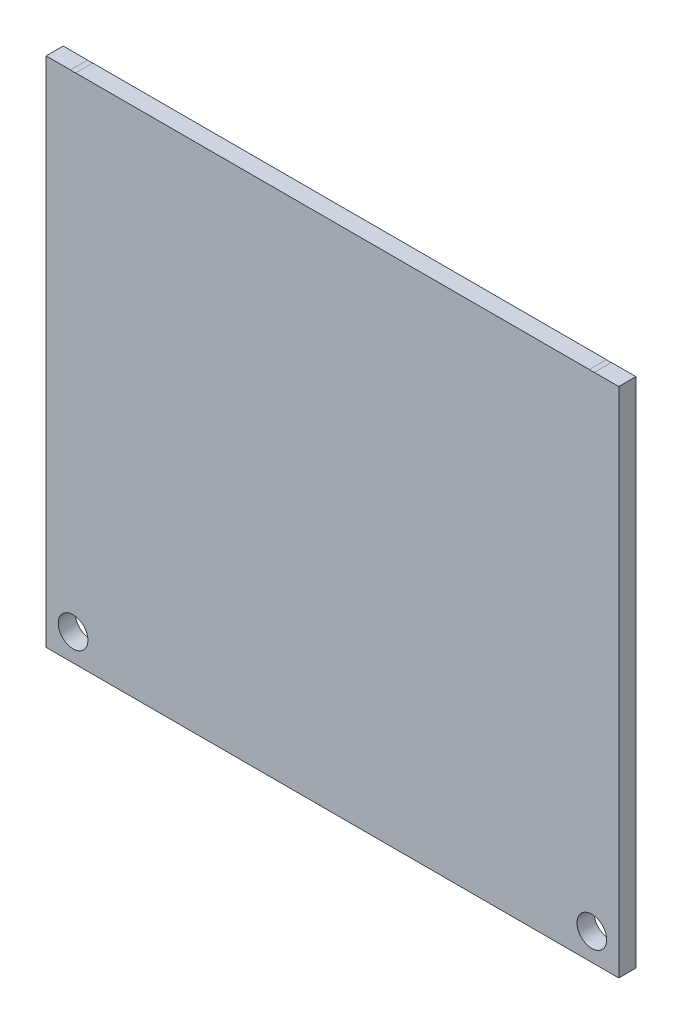
ISO-10303-21;
HEADER;
FILE_DESCRIPTION(('STEP AP214'),'2;1');
FILE_NAME('part.step','',(''),(''),'','','');
FILE_SCHEMA(('AUTOMOTIVE_DESIGN { 1 0 10303 214 1 1 1 1 }'));
ENDSEC;
DATA;
#1=APPLICATION_CONTEXT('core data for automotive mechanical design processes');
#2=APPLICATION_PROTOCOL_DEFINITION('international standard','automotive_design',2000,#1);
#3=PRODUCT_CONTEXT('',#1,'mechanical');
#4=PRODUCT('Part','Part','',(#3));
#5=PRODUCT_RELATED_PRODUCT_CATEGORY('part','',(#4));
#6=PRODUCT_DEFINITION_FORMATION('','',#4);
#7=PRODUCT_DEFINITION_CONTEXT('part definition',#1,'design');
#8=PRODUCT_DEFINITION('design','',#6,#7);
#9=PRODUCT_DEFINITION_SHAPE('','',#8);
#10=(LENGTH_UNIT() NAMED_UNIT(*) SI_UNIT(.MILLI.,.METRE.));
#11=(NAMED_UNIT(*) PLANE_ANGLE_UNIT() SI_UNIT($,.RADIAN.));
#12=(NAMED_UNIT(*) SI_UNIT($,.STERADIAN.) SOLID_ANGLE_UNIT());
#13=UNCERTAINTY_MEASURE_WITH_UNIT(LENGTH_MEASURE(1.E-05),#10,'distance_accuracy_value','');
#14=(GEOMETRIC_REPRESENTATION_CONTEXT(3) GLOBAL_UNCERTAINTY_ASSIGNED_CONTEXT((#13)) GLOBAL_UNIT_ASSIGNED_CONTEXT((#10,
#11,#12)) REPRESENTATION_CONTEXT('',''));
#15=CARTESIAN_POINT('',(0.,0.,0.));
#16=DIRECTION('',(0.,0.,1.));
#17=DIRECTION('',(1.,0.,0.));
#18=AXIS2_PLACEMENT_3D('',#15,#16,#17);
#19=CARTESIAN_POINT('',(-53.1,47.5,3.175));
#20=DIRECTION('',(0.,-1.,0.));
#21=DIRECTION('',(0.,0.,-1.));
#22=AXIS2_PLACEMENT_3D('',#19,#20,#21);
#23=PLANE('',#22);
#24=DIRECTION('',(-1.,0.,0.));
#25=VECTOR('',#24,1.);
#26=CARTESIAN_POINT('',(-53.1,47.5,3.175));
#27=LINE('',#26,#25);
#28=CARTESIAN_POINT('',(-48.5673328578255,47.5,3.175));
#29=VERTEX_POINT('',#28);
#30=CARTESIAN_POINT('',(-53.1,47.5,3.175));
#31=VERTEX_POINT('',#30);
#32=EDGE_CURVE('E115',#29,#31,#27,.T.);
#33=ORIENTED_EDGE('',*,*,#32,.F.);
#34=DIRECTION('',(0.,0.,-1.));
#35=VECTOR('',#34,1.);
#36=CARTESIAN_POINT('',(-48.5673328578255,47.5,3.176));
#37=LINE('',#36,#35);
#38=CARTESIAN_POINT('',(-48.5673328578255,47.5,0.));
#39=VERTEX_POINT('',#38);
#40=EDGE_CURVE('E102',#39,#29,#37,.F.);
#41=ORIENTED_EDGE('',*,*,#40,.F.);
#42=DIRECTION('',(-1.,0.,0.));
#43=VECTOR('',#42,1.);
#44=CARTESIAN_POINT('',(-53.1,47.5,0.));
#45=LINE('',#44,#43);
#46=CARTESIAN_POINT('',(-53.1,47.5,0.));
#47=VERTEX_POINT('',#46);
#48=EDGE_CURVE('E113',#39,#47,#45,.T.);
#49=ORIENTED_EDGE('',*,*,#48,.T.);
#50=DIRECTION('',(0.,0.,-1.));
#51=VECTOR('',#50,1.);
#52=CARTESIAN_POINT('',(-53.1,47.5,3.175));
#53=LINE('',#52,#51);
#54=EDGE_CURVE('E45',#31,#47,#53,.T.);
#55=ORIENTED_EDGE('',*,*,#54,.F.);
#56=EDGE_LOOP('',(#33,#41,#49,#55));
#57=FACE_BOUND('',#56,.T.);
#58=ADVANCED_FACE('F37',(#57),#23,.F.);
#59=CARTESIAN_POINT('',(47.6326671421727,47.5,0.));
#60=VERTEX_POINT('',#59);
#61=CARTESIAN_POINT('',(-47.6326671421774,47.5,0.));
#62=VERTEX_POINT('',#61);
#63=EDGE_CURVE('E122',#60,#62,#45,.T.);
#64=ORIENTED_EDGE('',*,*,#63,.T.);
#65=DIRECTION('',(0.,0.,-1.));
#66=VECTOR('',#65,1.);
#67=CARTESIAN_POINT('',(-47.6326671421774,47.5,3.176));
#68=LINE('',#67,#66);
#69=CARTESIAN_POINT('',(-47.6326671421774,47.5,3.175));
#70=VERTEX_POINT('',#69);
#71=EDGE_CURVE('E52',#70,#62,#68,.T.);
#72=ORIENTED_EDGE('',*,*,#71,.F.);
#73=CARTESIAN_POINT('',(47.6326671421727,47.5,3.175));
#74=VERTEX_POINT('',#73);
#75=EDGE_CURVE('E155',#74,#70,#27,.T.);
#76=ORIENTED_EDGE('',*,*,#75,.F.);
#77=DIRECTION('',(0.,0.,-1.));
#78=VECTOR('',#77,1.);
#79=CARTESIAN_POINT('',(47.6326671421727,47.5,3.176));
#80=LINE('',#79,#78);
#81=EDGE_CURVE('E163',#60,#74,#80,.F.);
#82=ORIENTED_EDGE('',*,*,#81,.F.);
#83=EDGE_LOOP('',(#64,#72,#76,#82));
#84=FACE_BOUND('',#83,.T.);
#85=ADVANCED_FACE('F198',(#84),#23,.F.);
#86=CARTESIAN_POINT('',(53.1,-47.5,3.175));
#87=DIRECTION('',(-1.,0.,0.));
#88=DIRECTION('',(0.,0.,1.));
#89=AXIS2_PLACEMENT_3D('',#86,#87,#88);
#90=PLANE('',#89);
#91=DIRECTION('',(0.,1.,0.));
#92=VECTOR('',#91,1.);
#93=CARTESIAN_POINT('',(53.1,-47.5,0.));
#94=LINE('',#93,#92);
#95=CARTESIAN_POINT('',(53.1,-47.5,0.));
#96=VERTEX_POINT('',#95);
#97=CARTESIAN_POINT('',(53.1,47.5,0.));
#98=VERTEX_POINT('',#97);
#99=EDGE_CURVE('E123',#96,#98,#94,.T.);
#100=ORIENTED_EDGE('',*,*,#99,.T.);
#101=DIRECTION('',(0.,0.,-1.));
#102=VECTOR('',#101,1.);
#103=CARTESIAN_POINT('',(53.1,47.5,3.175));
#104=LINE('',#103,#102);
#105=CARTESIAN_POINT('',(53.1,47.5,3.175));
#106=VERTEX_POINT('',#105);
#107=EDGE_CURVE('E11',#106,#98,#104,.T.);
#108=ORIENTED_EDGE('',*,*,#107,.F.);
#109=DIRECTION('',(0.,1.,0.));
#110=VECTOR('',#109,1.);
#111=CARTESIAN_POINT('',(53.1,-47.5,3.175));
#112=LINE('',#111,#110);
#113=CARTESIAN_POINT('',(53.1,-47.5,3.175));
#114=VERTEX_POINT('',#113);
#115=EDGE_CURVE('E138',#114,#106,#112,.T.);
#116=ORIENTED_EDGE('',*,*,#115,.F.);
#117=DIRECTION('',(0.,0.,-1.));
#118=VECTOR('',#117,1.);
#119=CARTESIAN_POINT('',(53.1,-47.5,3.175));
#120=LINE('',#119,#118);
#121=EDGE_CURVE('E141',#114,#96,#120,.T.);
#122=ORIENTED_EDGE('',*,*,#121,.T.);
#123=EDGE_LOOP('',(#100,#108,#116,#122));
#124=FACE_BOUND('',#123,.T.);
#125=ADVANCED_FACE('F39',(#124),#90,.F.);
#126=CARTESIAN_POINT('',(48.5673328578243,47.5,0.));
#127=VERTEX_POINT('',#126);
#128=EDGE_CURVE('E125',#98,#127,#45,.T.);
#129=ORIENTED_EDGE('',*,*,#128,.T.);
#130=DIRECTION('',(0.,0.,-1.));
#131=VECTOR('',#130,1.);
#132=CARTESIAN_POINT('',(48.5673328578243,47.5,3.176));
#133=LINE('',#132,#131);
#134=CARTESIAN_POINT('',(48.5673328578243,47.5,3.175));
#135=VERTEX_POINT('',#134);
#136=EDGE_CURVE('E60',#135,#127,#133,.T.);
#137=ORIENTED_EDGE('',*,*,#136,.F.);
#138=EDGE_CURVE('E151',#106,#135,#27,.T.);
#139=ORIENTED_EDGE('',*,*,#138,.F.);
#140=ORIENTED_EDGE('',*,*,#107,.T.);
#141=EDGE_LOOP('',(#129,#137,#139,#140));
#142=FACE_BOUND('',#141,.T.);
#143=ADVANCED_FACE('F199',(#142),#23,.F.);
#144=CARTESIAN_POINT('',(-53.1,-47.5,3.175));
#145=DIRECTION('',(1.,0.,0.));
#146=DIRECTION('',(0.,0.,-1.));
#147=AXIS2_PLACEMENT_3D('',#144,#145,#146);
#148=PLANE('',#147);
#149=DIRECTION('',(0.,-1.,0.));
#150=VECTOR('',#149,1.);
#151=CARTESIAN_POINT('',(-53.1,-47.5,0.));
#152=LINE('',#151,#150);
#153=CARTESIAN_POINT('',(-53.1,-47.5,0.));
#154=VERTEX_POINT('',#153);
#155=EDGE_CURVE('E121',#47,#154,#152,.T.);
#156=ORIENTED_EDGE('',*,*,#155,.T.);
#157=DIRECTION('',(0.,0.,-1.));
#158=VECTOR('',#157,1.);
#159=CARTESIAN_POINT('',(-53.1,-47.5,3.175));
#160=LINE('',#159,#158);
#161=CARTESIAN_POINT('',(-53.1,-47.5,3.175));
#162=VERTEX_POINT('',#161);
#163=EDGE_CURVE('E144',#162,#154,#160,.T.);
#164=ORIENTED_EDGE('',*,*,#163,.F.);
#165=DIRECTION('',(0.,-1.,0.));
#166=VECTOR('',#165,1.);
#167=CARTESIAN_POINT('',(-53.1,-47.5,3.175));
#168=LINE('',#167,#166);
#169=EDGE_CURVE('E148',#31,#162,#168,.T.);
#170=ORIENTED_EDGE('',*,*,#169,.F.);
#171=ORIENTED_EDGE('',*,*,#54,.T.);
#172=EDGE_LOOP('',(#156,#164,#170,#171));
#173=FACE_BOUND('',#172,.T.);
#174=ADVANCED_FACE('F147',(#173),#148,.F.);
#175=CARTESIAN_POINT('',(-53.1,-47.5,3.175));
#176=DIRECTION('',(0.,1.,0.));
#177=DIRECTION('',(0.,0.,1.));
#178=AXIS2_PLACEMENT_3D('',#175,#176,#177);
#179=PLANE('',#178);
#180=DIRECTION('',(1.,0.,0.));
#181=VECTOR('',#180,1.);
#182=CARTESIAN_POINT('',(-53.1,-47.5,0.));
#183=LINE('',#182,#181);
#184=EDGE_CURVE('E133',#154,#96,#183,.T.);
#185=ORIENTED_EDGE('',*,*,#184,.T.);
#186=ORIENTED_EDGE('',*,*,#121,.F.);
#187=DIRECTION('',(1.,0.,0.));
#188=VECTOR('',#187,1.);
#189=CARTESIAN_POINT('',(-53.1,-47.5,3.175));
#190=LINE('',#189,#188);
#191=EDGE_CURVE('E145',#162,#114,#190,.T.);
#192=ORIENTED_EDGE('',*,*,#191,.F.);
#193=ORIENTED_EDGE('',*,*,#163,.T.);
#194=EDGE_LOOP('',(#185,#186,#192,#193));
#195=FACE_BOUND('',#194,.T.);
#196=ADVANCED_FACE('F193',(#195),#179,.F.);
#197=CARTESIAN_POINT('',(0.,0.,3.175));
#198=DIRECTION('',(0.,0.,-1.));
#199=DIRECTION('',(-1.,0.,0.));
#200=AXIS2_PLACEMENT_3D('',#197,#198,#199);
#201=PLANE('',#200);
#202=CARTESIAN_POINT('',(-48.1000000000017,-42.5000000000004,3.175));
#203=DIRECTION('',(0.,0.,-1.));
#204=DIRECTION('',(-1.,0.,0.));
#205=AXIS2_PLACEMENT_3D('',#202,#203,#204);
#206=CIRCLE('',#205,2.75);
#207=CARTESIAN_POINT('',(-50.8500000000017,-42.5000000000004,3.175));
#208=VERTEX_POINT('',#207);
#209=EDGE_CURVE('E170',#208,#208,#206,.F.);
#210=ORIENTED_EDGE('',*,*,#209,.F.);
#211=EDGE_LOOP('',(#210));
#212=FACE_BOUND('',#211,.T.);
#213=CARTESIAN_POINT('',(48.0999999999982,-42.5000000000007,3.175));
#214=DIRECTION('',(0.,0.,-1.));
#215=DIRECTION('',(-1.,0.,0.));
#216=AXIS2_PLACEMENT_3D('',#213,#214,#215);
#217=CIRCLE('',#216,2.74999999999999);
#218=CARTESIAN_POINT('',(45.3499999999982,-42.5000000000007,3.175));
#219=VERTEX_POINT('',#218);
#220=EDGE_CURVE('E166',#219,#219,#217,.F.);
#221=ORIENTED_EDGE('',*,*,#220,.F.);
#222=EDGE_LOOP('',(#221));
#223=FACE_BOUND('',#222,.T.);
#224=ORIENTED_EDGE('',*,*,#75,.T.);
#225=CARTESIAN_POINT('',(-48.1000000000015,50.2099999999996,3.175));
#226=DIRECTION('',(0.,0.,-1.));
#227=DIRECTION('',(-1.,0.,0.));
#228=AXIS2_PLACEMENT_3D('',#225,#226,#227);
#229=CIRCLE('',#228,2.75);
#230=EDGE_CURVE('E108',#29,#70,#229,.F.);
#231=ORIENTED_EDGE('',*,*,#230,.F.);
#232=ORIENTED_EDGE('',*,*,#32,.T.);
#233=ORIENTED_EDGE('',*,*,#169,.T.);
#234=ORIENTED_EDGE('',*,*,#191,.T.);
#235=ORIENTED_EDGE('',*,*,#115,.T.);
#236=ORIENTED_EDGE('',*,*,#138,.T.);
#237=CARTESIAN_POINT('',(48.0999999999985,50.2099999999993,3.175));
#238=DIRECTION('',(0.,0.,-1.));
#239=DIRECTION('',(-1.,0.,0.));
#240=AXIS2_PLACEMENT_3D('',#237,#238,#239);
#241=CIRCLE('',#240,2.75000000000001);
#242=EDGE_CURVE('E127',#74,#135,#241,.F.);
#243=ORIENTED_EDGE('',*,*,#242,.F.);
#244=EDGE_LOOP('',(#224,#231,#232,#233,#234,#235,#236,#243));
#245=FACE_BOUND('',#244,.T.);
#246=ADVANCED_FACE('F186',(#212,#223,#245),#201,.F.);
#247=CARTESIAN_POINT('',(0.,0.,0.));
#248=DIRECTION('',(0.,0.,-1.));
#249=DIRECTION('',(-1.,0.,0.));
#250=AXIS2_PLACEMENT_3D('',#247,#248,#249);
#251=PLANE('',#250);
#252=CARTESIAN_POINT('',(-48.1000000000015,50.2099999999996,0.));
#253=DIRECTION('',(0.,0.,-1.));
#254=DIRECTION('',(-1.,0.,0.));
#255=AXIS2_PLACEMENT_3D('',#252,#253,#254);
#256=CIRCLE('',#255,2.75);
#257=EDGE_CURVE('E99',#62,#39,#256,.T.);
#258=ORIENTED_EDGE('',*,*,#257,.F.);
#259=ORIENTED_EDGE('',*,*,#63,.F.);
#260=CARTESIAN_POINT('',(48.0999999999985,50.2099999999993,0.));
#261=DIRECTION('',(0.,0.,-1.));
#262=DIRECTION('',(-1.,0.,0.));
#263=AXIS2_PLACEMENT_3D('',#260,#261,#262);
#264=CIRCLE('',#263,2.75000000000001);
#265=EDGE_CURVE('E161',#127,#60,#264,.T.);
#266=ORIENTED_EDGE('',*,*,#265,.F.);
#267=ORIENTED_EDGE('',*,*,#128,.F.);
#268=ORIENTED_EDGE('',*,*,#99,.F.);
#269=ORIENTED_EDGE('',*,*,#184,.F.);
#270=ORIENTED_EDGE('',*,*,#155,.F.);
#271=ORIENTED_EDGE('',*,*,#48,.F.);
#272=EDGE_LOOP('',(#258,#259,#266,#267,#268,#269,#270,#271));
#273=FACE_BOUND('',#272,.T.);
#274=CARTESIAN_POINT('',(-48.1000000000017,-42.5000000000004,0.));
#275=DIRECTION('',(0.,0.,-1.));
#276=DIRECTION('',(-1.,0.,0.));
#277=AXIS2_PLACEMENT_3D('',#274,#275,#276);
#278=CIRCLE('',#277,2.75);
#279=CARTESIAN_POINT('',(-50.8500000000017,-42.5000000000004,0.));
#280=VERTEX_POINT('',#279);
#281=EDGE_CURVE('E167',#280,#280,#278,.T.);
#282=ORIENTED_EDGE('',*,*,#281,.F.);
#283=EDGE_LOOP('',(#282));
#284=FACE_BOUND('',#283,.T.);
#285=CARTESIAN_POINT('',(48.0999999999982,-42.5000000000007,0.));
#286=DIRECTION('',(0.,0.,-1.));
#287=DIRECTION('',(-1.,0.,0.));
#288=AXIS2_PLACEMENT_3D('',#285,#286,#287);
#289=CIRCLE('',#288,2.74999999999999);
#290=CARTESIAN_POINT('',(45.3499999999982,-42.5000000000007,0.));
#291=VERTEX_POINT('',#290);
#292=EDGE_CURVE('E173',#291,#291,#289,.T.);
#293=ORIENTED_EDGE('',*,*,#292,.F.);
#294=EDGE_LOOP('',(#293));
#295=FACE_BOUND('',#294,.T.);
#296=ADVANCED_FACE('F118',(#273,#284,#295),#251,.T.);
#297=CARTESIAN_POINT('',(48.0999999999985,50.2099999999993,3.176));
#298=DIRECTION('',(0.,0.,-1.));
#299=DIRECTION('',(-1.,0.,0.));
#300=AXIS2_PLACEMENT_3D('',#297,#298,#299);
#301=CYLINDRICAL_SURFACE('',#300,2.75000000000001);
#302=ORIENTED_EDGE('',*,*,#81,.T.);
#303=ORIENTED_EDGE('',*,*,#242,.T.);
#304=ORIENTED_EDGE('',*,*,#136,.T.);
#305=ORIENTED_EDGE('',*,*,#265,.T.);
#306=EDGE_LOOP('',(#302,#303,#304,#305));
#307=FACE_BOUND('',#306,.T.);
#308=ADVANCED_FACE('F185',(#307),#301,.F.);
#309=CARTESIAN_POINT('',(48.0999999999982,-42.5000000000007,3.176));
#310=DIRECTION('',(0.,0.,-1.));
#311=DIRECTION('',(-1.,0.,0.));
#312=AXIS2_PLACEMENT_3D('',#309,#310,#311);
#313=CYLINDRICAL_SURFACE('',#312,2.74999999999999);
#314=ORIENTED_EDGE('',*,*,#292,.T.);
#315=EDGE_LOOP('',(#314));
#316=FACE_BOUND('',#315,.T.);
#317=ORIENTED_EDGE('',*,*,#220,.T.);
#318=EDGE_LOOP('',(#317));
#319=FACE_BOUND('',#318,.T.);
#320=ADVANCED_FACE('F181',(#316,#319),#313,.F.);
#321=CARTESIAN_POINT('',(-48.1000000000017,-42.5000000000004,3.176));
#322=DIRECTION('',(0.,0.,-1.));
#323=DIRECTION('',(-1.,0.,0.));
#324=AXIS2_PLACEMENT_3D('',#321,#322,#323);
#325=CYLINDRICAL_SURFACE('',#324,2.75);
#326=ORIENTED_EDGE('',*,*,#281,.T.);
#327=EDGE_LOOP('',(#326));
#328=FACE_BOUND('',#327,.T.);
#329=ORIENTED_EDGE('',*,*,#209,.T.);
#330=EDGE_LOOP('',(#329));
#331=FACE_BOUND('',#330,.T.);
#332=ADVANCED_FACE('F250',(#328,#331),#325,.F.);
#333=CARTESIAN_POINT('',(-48.1000000000015,50.2099999999996,3.176));
#334=DIRECTION('',(0.,0.,-1.));
#335=DIRECTION('',(-1.,0.,0.));
#336=AXIS2_PLACEMENT_3D('',#333,#334,#335);
#337=CYLINDRICAL_SURFACE('',#336,2.75);
#338=ORIENTED_EDGE('',*,*,#40,.T.);
#339=ORIENTED_EDGE('',*,*,#230,.T.);
#340=ORIENTED_EDGE('',*,*,#71,.T.);
#341=ORIENTED_EDGE('',*,*,#257,.T.);
#342=EDGE_LOOP('',(#338,#339,#340,#341));
#343=FACE_BOUND('',#342,.T.);
#344=ADVANCED_FACE('F101',(#343),#337,.F.);
#345=CLOSED_SHELL('',(#58,#85,#125,#143,#174,#196,#246,#296,#308,#320,#332,#344));
#346=MANIFOLD_SOLID_BREP('B2',#345);
#347=ADVANCED_BREP_SHAPE_REPRESENTATION('',(#18,#346),#14);
#348=SHAPE_DEFINITION_REPRESENTATION(#9,#347);
ENDSEC;
END-ISO-10303-21;
